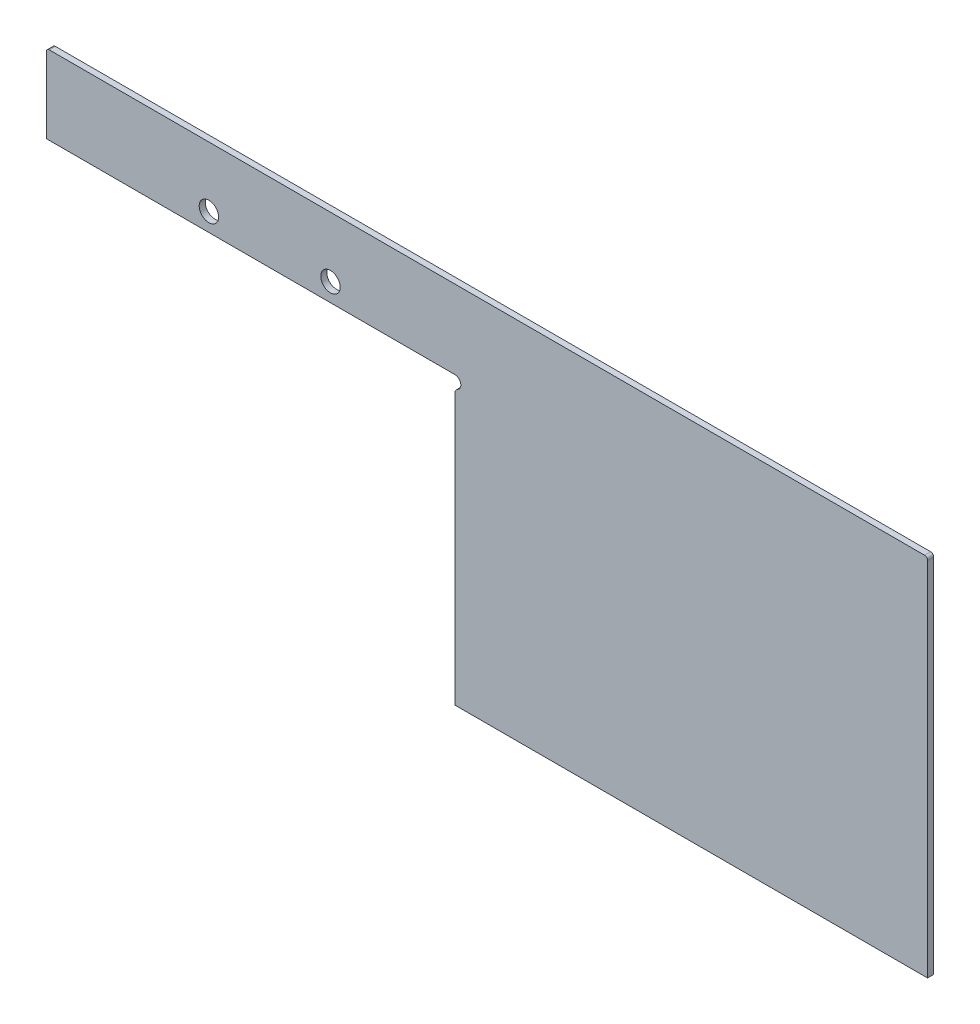
ISO-10303-21;
HEADER;
FILE_DESCRIPTION(('STEP AP214'),'2;1');
FILE_NAME('part.step','',(''),(''),'','','');
FILE_SCHEMA(('AUTOMOTIVE_DESIGN { 1 0 10303 214 1 1 1 1 }'));
ENDSEC;
DATA;
#1=APPLICATION_CONTEXT('core data for automotive mechanical design processes');
#2=APPLICATION_PROTOCOL_DEFINITION('international standard','automotive_design',2000,#1);
#3=PRODUCT_CONTEXT('',#1,'mechanical');
#4=PRODUCT('Part','Part','',(#3));
#5=PRODUCT_RELATED_PRODUCT_CATEGORY('part','',(#4));
#6=PRODUCT_DEFINITION_FORMATION('','',#4);
#7=PRODUCT_DEFINITION_CONTEXT('part definition',#1,'design');
#8=PRODUCT_DEFINITION('design','',#6,#7);
#9=PRODUCT_DEFINITION_SHAPE('','',#8);
#10=(LENGTH_UNIT() NAMED_UNIT(*) SI_UNIT(.MILLI.,.METRE.));
#11=(NAMED_UNIT(*) PLANE_ANGLE_UNIT() SI_UNIT($,.RADIAN.));
#12=(NAMED_UNIT(*) SI_UNIT($,.STERADIAN.) SOLID_ANGLE_UNIT());
#13=UNCERTAINTY_MEASURE_WITH_UNIT(LENGTH_MEASURE(1.E-05),#10,'distance_accuracy_value','');
#14=(GEOMETRIC_REPRESENTATION_CONTEXT(3) GLOBAL_UNCERTAINTY_ASSIGNED_CONTEXT((#13)) GLOBAL_UNIT_ASSIGNED_CONTEXT((#10,
#11,#12)) REPRESENTATION_CONTEXT('',''));
#15=CARTESIAN_POINT('',(0.,0.,0.));
#16=DIRECTION('',(0.,0.,1.));
#17=DIRECTION('',(1.,0.,0.));
#18=AXIS2_PLACEMENT_3D('',#15,#16,#17);
#19=CARTESIAN_POINT('',(0.,0.,1.));
#20=DIRECTION('',(0.,0.,-1.));
#21=DIRECTION('',(-1.,0.,0.));
#22=AXIS2_PLACEMENT_3D('',#19,#20,#21);
#23=PLANE('',#22);
#24=DIRECTION('',(-1.,0.,0.));
#25=VECTOR('',#24,1.);
#26=CARTESIAN_POINT('',(0.,12.9,1.));
#27=LINE('',#26,#25);
#28=CARTESIAN_POINT('',(145.,12.9,1.));
#29=VERTEX_POINT('',#28);
#30=CARTESIAN_POINT('',(1.,12.9,1.));
#31=VERTEX_POINT('',#30);
#32=EDGE_CURVE('E141',#29,#31,#27,.T.);
#33=ORIENTED_EDGE('',*,*,#32,.T.);
#34=CARTESIAN_POINT('',(1.,12.4,1.));
#35=DIRECTION('',(0.,0.,-1.));
#36=DIRECTION('',(-1.,0.,0.));
#37=AXIS2_PLACEMENT_3D('',#34,#35,#36);
#38=CIRCLE('',#37,0.5);
#39=CARTESIAN_POINT('',(0.5,12.4,1.));
#40=VERTEX_POINT('',#39);
#41=EDGE_CURVE('E170',#31,#40,#38,.F.);
#42=ORIENTED_EDGE('',*,*,#41,.T.);
#43=DIRECTION('',(0.,1.,0.));
#44=VECTOR('',#43,1.);
#45=CARTESIAN_POINT('',(0.5,12.9,1.));
#46=LINE('',#45,#44);
#47=CARTESIAN_POINT('',(0.500000000000002,0.,1.));
#48=VERTEX_POINT('',#47);
#49=EDGE_CURVE('E116',#48,#40,#46,.T.);
#50=ORIENTED_EDGE('',*,*,#49,.F.);
#51=DIRECTION('',(1.,0.,0.));
#52=VECTOR('',#51,1.);
#53=CARTESIAN_POINT('',(67.7,0.,1.));
#54=LINE('',#53,#52);
#55=CARTESIAN_POINT('',(67.7,0.,1.));
#56=VERTEX_POINT('',#55);
#57=EDGE_CURVE('E124',#48,#56,#54,.T.);
#58=ORIENTED_EDGE('',*,*,#57,.T.);
#59=CARTESIAN_POINT('',(67.7,-1.,1.));
#60=DIRECTION('',(0.,0.,1.));
#61=DIRECTION('',(1.,0.,0.));
#62=AXIS2_PLACEMENT_3D('',#59,#60,#61);
#63=CIRCLE('',#62,0.999999999999998);
#64=CARTESIAN_POINT('',(68.2,-1.86602540378444,1.));
#65=VERTEX_POINT('',#64);
#66=EDGE_CURVE('E125',#65,#56,#63,.T.);
#67=ORIENTED_EDGE('',*,*,#66,.F.);
#68=CARTESIAN_POINT('',(68.7,-2.73205080756887,1.));
#69=DIRECTION('',(0.,0.,-1.));
#70=DIRECTION('',(-1.,0.,0.));
#71=AXIS2_PLACEMENT_3D('',#68,#69,#70);
#72=CIRCLE('',#71,1.);
#73=CARTESIAN_POINT('',(67.7,-2.73205080756887,1.));
#74=VERTEX_POINT('',#73);
#75=EDGE_CURVE('E161',#65,#74,#72,.F.);
#76=ORIENTED_EDGE('',*,*,#75,.T.);
#77=DIRECTION('',(0.,-1.,0.));
#78=VECTOR('',#77,1.);
#79=CARTESIAN_POINT('',(67.7,-47.1,1.));
#80=LINE('',#79,#78);
#81=CARTESIAN_POINT('',(67.7,-47.1,1.));
#82=VERTEX_POINT('',#81);
#83=EDGE_CURVE('E204',#74,#82,#80,.T.);
#84=ORIENTED_EDGE('',*,*,#83,.T.);
#85=DIRECTION('',(1.,0.,0.));
#86=VECTOR('',#85,1.);
#87=CARTESIAN_POINT('',(146.,-47.1,1.));
#88=LINE('',#87,#86);
#89=CARTESIAN_POINT('',(145.5,-47.1,1.));
#90=VERTEX_POINT('',#89);
#91=EDGE_CURVE('E205',#82,#90,#88,.T.);
#92=ORIENTED_EDGE('',*,*,#91,.T.);
#93=DIRECTION('',(0.,-1.,0.));
#94=VECTOR('',#93,1.);
#95=CARTESIAN_POINT('',(145.5,12.9,1.));
#96=LINE('',#95,#94);
#97=CARTESIAN_POINT('',(145.5,12.4,1.));
#98=VERTEX_POINT('',#97);
#99=EDGE_CURVE('E190',#98,#90,#96,.T.);
#100=ORIENTED_EDGE('',*,*,#99,.F.);
#101=CARTESIAN_POINT('',(145.,12.4,1.));
#102=DIRECTION('',(0.,0.,-1.));
#103=DIRECTION('',(-1.,0.,0.));
#104=AXIS2_PLACEMENT_3D('',#101,#102,#103);
#105=CIRCLE('',#104,0.5);
#106=EDGE_CURVE('E168',#98,#29,#105,.F.);
#107=ORIENTED_EDGE('',*,*,#106,.T.);
#108=EDGE_LOOP('',(#33,#42,#50,#58,#67,#76,#84,#92,#100,#107));
#109=FACE_BOUND('',#108,.T.);
#110=CARTESIAN_POINT('',(47.25,3.,1.));
#111=DIRECTION('',(0.,0.,1.));
#112=DIRECTION('',(-1.,0.,0.));
#113=AXIS2_PLACEMENT_3D('',#110,#111,#112);
#114=CIRCLE('',#113,1.59999999999996);
#115=CARTESIAN_POINT('',(45.65,3.,1.));
#116=VERTEX_POINT('',#115);
#117=EDGE_CURVE('E133',#116,#116,#114,.T.);
#118=ORIENTED_EDGE('',*,*,#117,.F.);
#119=EDGE_LOOP('',(#118));
#120=FACE_BOUND('',#119,.T.);
#121=CARTESIAN_POINT('',(27.25,3.,1.));
#122=DIRECTION('',(0.,0.,1.));
#123=DIRECTION('',(-1.,0.,0.));
#124=AXIS2_PLACEMENT_3D('',#121,#122,#123);
#125=CIRCLE('',#124,1.60000000000002);
#126=CARTESIAN_POINT('',(25.65,3.,1.));
#127=VERTEX_POINT('',#126);
#128=EDGE_CURVE('E196',#127,#127,#125,.T.);
#129=ORIENTED_EDGE('',*,*,#128,.F.);
#130=EDGE_LOOP('',(#129));
#131=FACE_BOUND('',#130,.T.);
#132=ADVANCED_FACE('F33',(#109,#120,#131),#23,.F.);
#133=CARTESIAN_POINT('',(0.,0.,0.));
#134=DIRECTION('',(0.,0.,-1.));
#135=DIRECTION('',(-1.,0.,0.));
#136=AXIS2_PLACEMENT_3D('',#133,#134,#135);
#137=PLANE('',#136);
#138=DIRECTION('',(0.,1.,0.));
#139=VECTOR('',#138,1.);
#140=CARTESIAN_POINT('',(0.5,12.9,0.));
#141=LINE('',#140,#139);
#142=CARTESIAN_POINT('',(0.500000000000002,0.,0.));
#143=VERTEX_POINT('',#142);
#144=CARTESIAN_POINT('',(0.5,12.4,0.));
#145=VERTEX_POINT('',#144);
#146=EDGE_CURVE('E109',#143,#145,#141,.T.);
#147=ORIENTED_EDGE('',*,*,#146,.T.);
#148=CARTESIAN_POINT('',(1.,12.4,0.));
#149=DIRECTION('',(0.,0.,-1.));
#150=DIRECTION('',(-1.,0.,0.));
#151=AXIS2_PLACEMENT_3D('',#148,#149,#150);
#152=CIRCLE('',#151,0.5);
#153=CARTESIAN_POINT('',(1.,12.9,0.));
#154=VERTEX_POINT('',#153);
#155=EDGE_CURVE('E41',#145,#154,#152,.T.);
#156=ORIENTED_EDGE('',*,*,#155,.T.);
#157=DIRECTION('',(-1.,0.,0.));
#158=VECTOR('',#157,1.);
#159=CARTESIAN_POINT('',(0.,12.9,0.));
#160=LINE('',#159,#158);
#161=CARTESIAN_POINT('',(145.,12.9,0.));
#162=VERTEX_POINT('',#161);
#163=EDGE_CURVE('E146',#162,#154,#160,.T.);
#164=ORIENTED_EDGE('',*,*,#163,.F.);
#165=CARTESIAN_POINT('',(145.,12.4,0.));
#166=DIRECTION('',(0.,0.,-1.));
#167=DIRECTION('',(-1.,0.,0.));
#168=AXIS2_PLACEMENT_3D('',#165,#166,#167);
#169=CIRCLE('',#168,0.5);
#170=CARTESIAN_POINT('',(145.5,12.4,0.));
#171=VERTEX_POINT('',#170);
#172=EDGE_CURVE('E48',#162,#171,#169,.T.);
#173=ORIENTED_EDGE('',*,*,#172,.T.);
#174=DIRECTION('',(0.,-1.,0.));
#175=VECTOR('',#174,1.);
#176=CARTESIAN_POINT('',(145.5,12.9,0.));
#177=LINE('',#176,#175);
#178=CARTESIAN_POINT('',(145.5,-47.1,0.));
#179=VERTEX_POINT('',#178);
#180=EDGE_CURVE('E186',#171,#179,#177,.T.);
#181=ORIENTED_EDGE('',*,*,#180,.T.);
#182=DIRECTION('',(1.,0.,0.));
#183=VECTOR('',#182,1.);
#184=CARTESIAN_POINT('',(146.,-47.1,0.));
#185=LINE('',#184,#183);
#186=CARTESIAN_POINT('',(67.7,-47.1,0.));
#187=VERTEX_POINT('',#186);
#188=EDGE_CURVE('E135',#187,#179,#185,.T.);
#189=ORIENTED_EDGE('',*,*,#188,.F.);
#190=DIRECTION('',(0.,-1.,0.));
#191=VECTOR('',#190,1.);
#192=CARTESIAN_POINT('',(67.7,-47.1,0.));
#193=LINE('',#192,#191);
#194=CARTESIAN_POINT('',(67.7,-2.73205080756887,0.));
#195=VERTEX_POINT('',#194);
#196=EDGE_CURVE('E132',#195,#187,#193,.T.);
#197=ORIENTED_EDGE('',*,*,#196,.F.);
#198=CARTESIAN_POINT('',(68.7,-2.73205080756887,0.));
#199=DIRECTION('',(0.,0.,-1.));
#200=DIRECTION('',(-1.,0.,0.));
#201=AXIS2_PLACEMENT_3D('',#198,#199,#200);
#202=CIRCLE('',#201,1.);
#203=CARTESIAN_POINT('',(68.2,-1.86602540378444,0.));
#204=VERTEX_POINT('',#203);
#205=EDGE_CURVE('E157',#195,#204,#202,.T.);
#206=ORIENTED_EDGE('',*,*,#205,.T.);
#207=CARTESIAN_POINT('',(67.7,-1.,0.));
#208=DIRECTION('',(0.,0.,-1.));
#209=DIRECTION('',(-1.,0.,0.));
#210=AXIS2_PLACEMENT_3D('',#207,#208,#209);
#211=CIRCLE('',#210,0.999999999999998);
#212=CARTESIAN_POINT('',(67.7,0.,0.));
#213=VERTEX_POINT('',#212);
#214=EDGE_CURVE('E131',#213,#204,#211,.T.);
#215=ORIENTED_EDGE('',*,*,#214,.F.);
#216=DIRECTION('',(1.,0.,0.));
#217=VECTOR('',#216,1.);
#218=CARTESIAN_POINT('',(67.7,0.,0.));
#219=LINE('',#218,#217);
#220=EDGE_CURVE('E122',#143,#213,#219,.T.);
#221=ORIENTED_EDGE('',*,*,#220,.F.);
#222=EDGE_LOOP('',(#147,#156,#164,#173,#181,#189,#197,#206,#215,#221));
#223=FACE_BOUND('',#222,.T.);
#224=CARTESIAN_POINT('',(47.25,3.,0.));
#225=DIRECTION('',(0.,0.,1.));
#226=DIRECTION('',(-1.,0.,0.));
#227=AXIS2_PLACEMENT_3D('',#224,#225,#226);
#228=CIRCLE('',#227,1.59999999999996);
#229=CARTESIAN_POINT('',(45.65,3.,0.));
#230=VERTEX_POINT('',#229);
#231=EDGE_CURVE('E138',#230,#230,#228,.T.);
#232=ORIENTED_EDGE('',*,*,#231,.T.);
#233=EDGE_LOOP('',(#232));
#234=FACE_BOUND('',#233,.T.);
#235=CARTESIAN_POINT('',(27.25,3.,0.));
#236=DIRECTION('',(0.,0.,1.));
#237=DIRECTION('',(-1.,0.,0.));
#238=AXIS2_PLACEMENT_3D('',#235,#236,#237);
#239=CIRCLE('',#238,1.60000000000002);
#240=CARTESIAN_POINT('',(25.65,3.,0.));
#241=VERTEX_POINT('',#240);
#242=EDGE_CURVE('E195',#241,#241,#239,.T.);
#243=ORIENTED_EDGE('',*,*,#242,.T.);
#244=EDGE_LOOP('',(#243));
#245=FACE_BOUND('',#244,.T.);
#246=ADVANCED_FACE('F128',(#223,#234,#245),#137,.T.);
#247=CARTESIAN_POINT('',(67.7,0.,1.));
#248=DIRECTION('',(0.,1.,0.));
#249=DIRECTION('',(-1.,0.,0.));
#250=AXIS2_PLACEMENT_3D('',#247,#248,#249);
#251=PLANE('',#250);
#252=ORIENTED_EDGE('',*,*,#57,.F.);
#253=DIRECTION('',(0.,0.,1.));
#254=VECTOR('',#253,1.);
#255=CARTESIAN_POINT('',(0.500000000000002,0.,0.));
#256=LINE('',#255,#254);
#257=EDGE_CURVE('E112',#143,#48,#256,.T.);
#258=ORIENTED_EDGE('',*,*,#257,.F.);
#259=ORIENTED_EDGE('',*,*,#220,.T.);
#260=DIRECTION('',(0.,0.,-1.));
#261=VECTOR('',#260,1.);
#262=CARTESIAN_POINT('',(67.7,0.,1.));
#263=LINE('',#262,#261);
#264=EDGE_CURVE('E152',#56,#213,#263,.T.);
#265=ORIENTED_EDGE('',*,*,#264,.F.);
#266=EDGE_LOOP('',(#252,#258,#259,#265));
#267=FACE_BOUND('',#266,.T.);
#268=ADVANCED_FACE('F120',(#267),#251,.F.);
#269=CARTESIAN_POINT('',(67.7,-47.1,1.));
#270=DIRECTION('',(1.,0.,0.));
#271=DIRECTION('',(0.,0.,-1.));
#272=AXIS2_PLACEMENT_3D('',#269,#270,#271);
#273=PLANE('',#272);
#274=ORIENTED_EDGE('',*,*,#83,.F.);
#275=DIRECTION('',(0.,0.,1.));
#276=VECTOR('',#275,1.);
#277=CARTESIAN_POINT('',(67.7,-2.73205080756887,1.));
#278=LINE('',#277,#276);
#279=EDGE_CURVE('E154',#74,#195,#278,.F.);
#280=ORIENTED_EDGE('',*,*,#279,.T.);
#281=ORIENTED_EDGE('',*,*,#196,.T.);
#282=DIRECTION('',(0.,0.,-1.));
#283=VECTOR('',#282,1.);
#284=CARTESIAN_POINT('',(67.7,-47.1,1.));
#285=LINE('',#284,#283);
#286=EDGE_CURVE('E149',#82,#187,#285,.T.);
#287=ORIENTED_EDGE('',*,*,#286,.F.);
#288=EDGE_LOOP('',(#274,#280,#281,#287));
#289=FACE_BOUND('',#288,.T.);
#290=ADVANCED_FACE('F237',(#289),#273,.F.);
#291=CARTESIAN_POINT('',(146.,-47.1,1.));
#292=DIRECTION('',(0.,1.,0.));
#293=DIRECTION('',(0.,0.,1.));
#294=AXIS2_PLACEMENT_3D('',#291,#292,#293);
#295=PLANE('',#294);
#296=ORIENTED_EDGE('',*,*,#188,.T.);
#297=DIRECTION('',(0.,0.,1.));
#298=VECTOR('',#297,1.);
#299=CARTESIAN_POINT('',(145.5,-47.1,0.));
#300=LINE('',#299,#298);
#301=EDGE_CURVE('E183',#179,#90,#300,.T.);
#302=ORIENTED_EDGE('',*,*,#301,.T.);
#303=ORIENTED_EDGE('',*,*,#91,.F.);
#304=ORIENTED_EDGE('',*,*,#286,.T.);
#305=EDGE_LOOP('',(#296,#302,#303,#304));
#306=FACE_BOUND('',#305,.T.);
#307=ADVANCED_FACE('F212',(#306),#295,.F.);
#308=CARTESIAN_POINT('',(0.,12.9,1.));
#309=DIRECTION('',(0.,-1.,0.));
#310=DIRECTION('',(0.,0.,-1.));
#311=AXIS2_PLACEMENT_3D('',#308,#309,#310);
#312=PLANE('',#311);
#313=ORIENTED_EDGE('',*,*,#163,.T.);
#314=DIRECTION('',(0.,0.,1.));
#315=VECTOR('',#314,1.);
#316=CARTESIAN_POINT('',(1.,12.9,1.));
#317=LINE('',#316,#315);
#318=EDGE_CURVE('E165',#154,#31,#317,.T.);
#319=ORIENTED_EDGE('',*,*,#318,.T.);
#320=ORIENTED_EDGE('',*,*,#32,.F.);
#321=DIRECTION('',(0.,0.,1.));
#322=VECTOR('',#321,1.);
#323=CARTESIAN_POINT('',(145.,12.9,1.));
#324=LINE('',#323,#322);
#325=EDGE_CURVE('E163',#29,#162,#324,.F.);
#326=ORIENTED_EDGE('',*,*,#325,.T.);
#327=EDGE_LOOP('',(#313,#319,#320,#326));
#328=FACE_BOUND('',#327,.T.);
#329=ADVANCED_FACE('F176',(#328),#312,.F.);
#330=CARTESIAN_POINT('',(47.25,3.,1.));
#331=DIRECTION('',(0.,0.,-1.));
#332=DIRECTION('',(-1.,0.,0.));
#333=AXIS2_PLACEMENT_3D('',#330,#331,#332);
#334=CYLINDRICAL_SURFACE('',#333,1.59999999999996);
#335=ORIENTED_EDGE('',*,*,#117,.T.);
#336=EDGE_LOOP('',(#335));
#337=FACE_BOUND('',#336,.T.);
#338=ORIENTED_EDGE('',*,*,#231,.F.);
#339=EDGE_LOOP('',(#338));
#340=FACE_BOUND('',#339,.T.);
#341=ADVANCED_FACE('F231',(#337,#340),#334,.F.);
#342=CARTESIAN_POINT('',(27.25,3.,1.));
#343=DIRECTION('',(0.,0.,-1.));
#344=DIRECTION('',(-1.,0.,0.));
#345=AXIS2_PLACEMENT_3D('',#342,#343,#344);
#346=CYLINDRICAL_SURFACE('',#345,1.60000000000002);
#347=ORIENTED_EDGE('',*,*,#128,.T.);
#348=EDGE_LOOP('',(#347));
#349=FACE_BOUND('',#348,.T.);
#350=ORIENTED_EDGE('',*,*,#242,.F.);
#351=EDGE_LOOP('',(#350));
#352=FACE_BOUND('',#351,.T.);
#353=ADVANCED_FACE('F252',(#349,#352),#346,.F.);
#354=CARTESIAN_POINT('',(67.7,-1.,-9.));
#355=DIRECTION('',(0.,0.,1.));
#356=DIRECTION('',(1.,0.,0.));
#357=AXIS2_PLACEMENT_3D('',#354,#355,#356);
#358=CYLINDRICAL_SURFACE('',#357,0.999999999999998);
#359=ORIENTED_EDGE('',*,*,#214,.T.);
#360=DIRECTION('',(0.,0.,1.));
#361=VECTOR('',#360,1.);
#362=CARTESIAN_POINT('',(68.2,-1.86602540378444,-9.));
#363=LINE('',#362,#361);
#364=EDGE_CURVE('E159',#204,#65,#363,.T.);
#365=ORIENTED_EDGE('',*,*,#364,.T.);
#366=ORIENTED_EDGE('',*,*,#66,.T.);
#367=ORIENTED_EDGE('',*,*,#264,.T.);
#368=EDGE_LOOP('',(#359,#365,#366,#367));
#369=FACE_BOUND('',#368,.T.);
#370=ADVANCED_FACE('F245',(#369),#358,.F.);
#371=CARTESIAN_POINT('',(68.7,-2.73205080756887,-9.));
#372=DIRECTION('',(0.,0.,1.));
#373=DIRECTION('',(1.,0.,0.));
#374=AXIS2_PLACEMENT_3D('',#371,#372,#373);
#375=CYLINDRICAL_SURFACE('',#374,1.);
#376=ORIENTED_EDGE('',*,*,#75,.F.);
#377=ORIENTED_EDGE('',*,*,#364,.F.);
#378=ORIENTED_EDGE('',*,*,#205,.F.);
#379=ORIENTED_EDGE('',*,*,#279,.F.);
#380=EDGE_LOOP('',(#376,#377,#378,#379));
#381=FACE_BOUND('',#380,.T.);
#382=ADVANCED_FACE('F243',(#381),#375,.T.);
#383=CARTESIAN_POINT('',(145.5,12.9,0.));
#384=DIRECTION('',(-1.,0.,0.));
#385=DIRECTION('',(0.,0.,1.));
#386=AXIS2_PLACEMENT_3D('',#383,#384,#385);
#387=PLANE('',#386);
#388=ORIENTED_EDGE('',*,*,#180,.F.);
#389=DIRECTION('',(0.,0.,1.));
#390=VECTOR('',#389,1.);
#391=CARTESIAN_POINT('',(145.5,12.4,0.));
#392=LINE('',#391,#390);
#393=EDGE_CURVE('E11',#171,#98,#392,.T.);
#394=ORIENTED_EDGE('',*,*,#393,.T.);
#395=ORIENTED_EDGE('',*,*,#99,.T.);
#396=ORIENTED_EDGE('',*,*,#301,.F.);
#397=EDGE_LOOP('',(#388,#394,#395,#396));
#398=FACE_BOUND('',#397,.T.);
#399=ADVANCED_FACE('F216',(#398),#387,.F.);
#400=CARTESIAN_POINT('',(0.5,12.9,0.));
#401=DIRECTION('',(1.,0.,0.));
#402=DIRECTION('',(0.,1.,0.));
#403=AXIS2_PLACEMENT_3D('',#400,#401,#402);
#404=PLANE('',#403);
#405=ORIENTED_EDGE('',*,*,#49,.T.);
#406=DIRECTION('',(0.,0.,1.));
#407=VECTOR('',#406,1.);
#408=CARTESIAN_POINT('',(0.5,12.4,0.));
#409=LINE('',#408,#407);
#410=EDGE_CURVE('E56',#40,#145,#409,.F.);
#411=ORIENTED_EDGE('',*,*,#410,.T.);
#412=ORIENTED_EDGE('',*,*,#146,.F.);
#413=ORIENTED_EDGE('',*,*,#257,.T.);
#414=EDGE_LOOP('',(#405,#411,#412,#413));
#415=FACE_BOUND('',#414,.T.);
#416=ADVANCED_FACE('F111',(#415),#404,.F.);
#417=CARTESIAN_POINT('',(1.,12.4,1.));
#418=DIRECTION('',(0.,0.,1.));
#419=DIRECTION('',(1.,0.,0.));
#420=AXIS2_PLACEMENT_3D('',#417,#418,#419);
#421=CYLINDRICAL_SURFACE('',#420,0.5);
#422=ORIENTED_EDGE('',*,*,#155,.F.);
#423=ORIENTED_EDGE('',*,*,#410,.F.);
#424=ORIENTED_EDGE('',*,*,#41,.F.);
#425=ORIENTED_EDGE('',*,*,#318,.F.);
#426=EDGE_LOOP('',(#422,#423,#424,#425));
#427=FACE_BOUND('',#426,.T.);
#428=ADVANCED_FACE('F180',(#427),#421,.T.);
#429=CARTESIAN_POINT('',(145.,12.4,0.));
#430=DIRECTION('',(0.,0.,1.));
#431=DIRECTION('',(1.,0.,0.));
#432=AXIS2_PLACEMENT_3D('',#429,#430,#431);
#433=CYLINDRICAL_SURFACE('',#432,0.5);
#434=ORIENTED_EDGE('',*,*,#172,.F.);
#435=ORIENTED_EDGE('',*,*,#325,.F.);
#436=ORIENTED_EDGE('',*,*,#106,.F.);
#437=ORIENTED_EDGE('',*,*,#393,.F.);
#438=EDGE_LOOP('',(#434,#435,#436,#437));
#439=FACE_BOUND('',#438,.T.);
#440=ADVANCED_FACE('F35',(#439),#433,.T.);
#441=CLOSED_SHELL('',(#132,#246,#268,#290,#307,#329,#341,#353,#370,#382,#399,#416,#428,#440));
#442=MANIFOLD_SOLID_BREP('B2',#441);
#443=ADVANCED_BREP_SHAPE_REPRESENTATION('',(#18,#442),#14);
#444=SHAPE_DEFINITION_REPRESENTATION(#9,#443);
ENDSEC;
END-ISO-10303-21;
